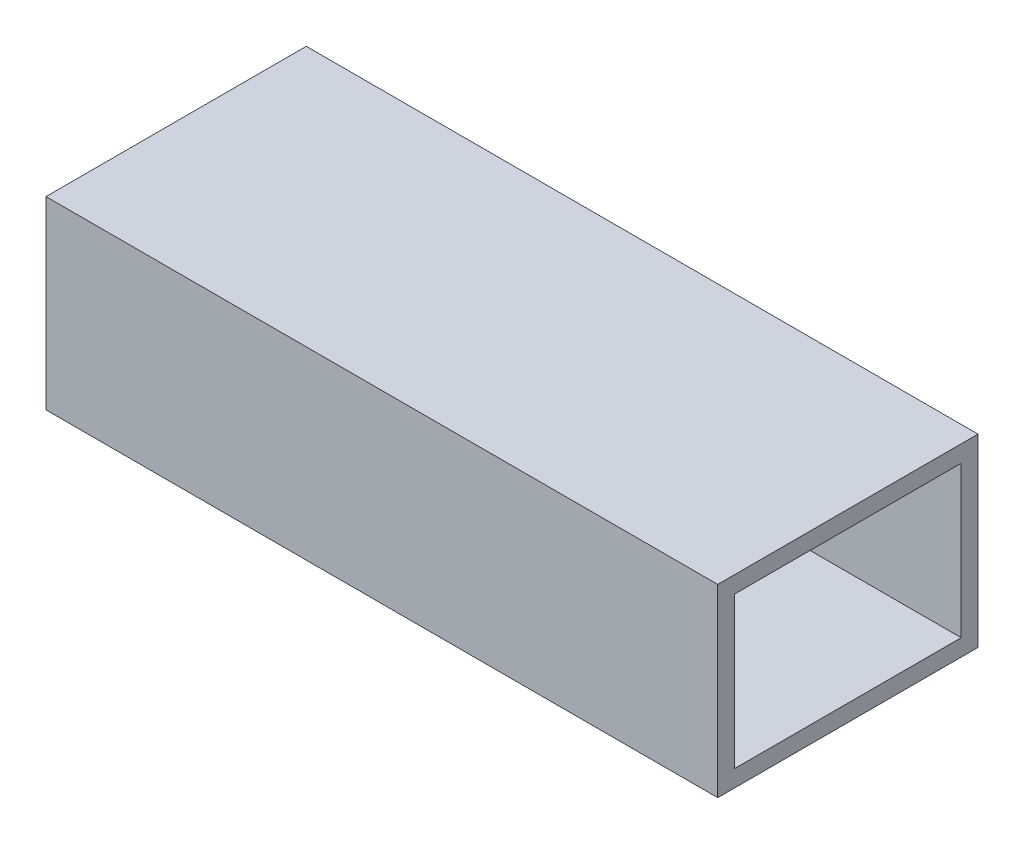
ISO-10303-21;
HEADER;
FILE_DESCRIPTION(('STEP AP214'),'2;1');
FILE_NAME('part.step','',(''),(''),'','','');
FILE_SCHEMA(('AUTOMOTIVE_DESIGN { 1 0 10303 214 1 1 1 1 }'));
ENDSEC;
DATA;
#1=APPLICATION_CONTEXT('core data for automotive mechanical design processes');
#2=APPLICATION_PROTOCOL_DEFINITION('international standard','automotive_design',2000,#1);
#3=PRODUCT_CONTEXT('',#1,'mechanical');
#4=PRODUCT('Part','Part','',(#3));
#5=PRODUCT_RELATED_PRODUCT_CATEGORY('part','',(#4));
#6=PRODUCT_DEFINITION_FORMATION('','',#4);
#7=PRODUCT_DEFINITION_CONTEXT('part definition',#1,'design');
#8=PRODUCT_DEFINITION('design','',#6,#7);
#9=PRODUCT_DEFINITION_SHAPE('','',#8);
#10=(LENGTH_UNIT() NAMED_UNIT(*) SI_UNIT(.MILLI.,.METRE.));
#11=(NAMED_UNIT(*) PLANE_ANGLE_UNIT() SI_UNIT($,.RADIAN.));
#12=(NAMED_UNIT(*) SI_UNIT($,.STERADIAN.) SOLID_ANGLE_UNIT());
#13=UNCERTAINTY_MEASURE_WITH_UNIT(LENGTH_MEASURE(1.E-05),#10,'distance_accuracy_value','');
#14=(GEOMETRIC_REPRESENTATION_CONTEXT(3) GLOBAL_UNCERTAINTY_ASSIGNED_CONTEXT((#13)) GLOBAL_UNIT_ASSIGNED_CONTEXT((#10,
#11,#12)) REPRESENTATION_CONTEXT('',''));
#15=CARTESIAN_POINT('',(0.,0.,0.));
#16=DIRECTION('',(0.,0.,1.));
#17=DIRECTION('',(1.,0.,0.));
#18=AXIS2_PLACEMENT_3D('',#15,#16,#17);
#19=CARTESIAN_POINT('',(203.2,0.,0.));
#20=DIRECTION('',(1.,0.,0.));
#21=DIRECTION('',(0.,0.,-1.));
#22=AXIS2_PLACEMENT_3D('',#19,#20,#21);
#23=PLANE('',#22);
#24=DIRECTION('',(0.,0.,-1.));
#25=VECTOR('',#24,1.);
#26=CARTESIAN_POINT('',(203.2,-5.08,5.08));
#27=LINE('',#26,#25);
#28=CARTESIAN_POINT('',(203.2,-5.08,5.08));
#29=VERTEX_POINT('',#28);
#30=CARTESIAN_POINT('',(203.2,-5.08,-73.66));
#31=VERTEX_POINT('',#30);
#32=EDGE_CURVE('E134',#29,#31,#27,.T.);
#33=ORIENTED_EDGE('',*,*,#32,.T.);
#34=DIRECTION('',(0.,1.,0.));
#35=VECTOR('',#34,1.);
#36=CARTESIAN_POINT('',(203.2,-5.08,-73.66));
#37=LINE('',#36,#35);
#38=CARTESIAN_POINT('',(203.2,50.8,-73.66));
#39=VERTEX_POINT('',#38);
#40=EDGE_CURVE('E137',#31,#39,#37,.T.);
#41=ORIENTED_EDGE('',*,*,#40,.T.);
#42=DIRECTION('',(0.,0.,1.));
#43=VECTOR('',#42,1.);
#44=CARTESIAN_POINT('',(203.2,50.8,5.08));
#45=LINE('',#44,#43);
#46=CARTESIAN_POINT('',(203.2,50.8,5.08));
#47=VERTEX_POINT('',#46);
#48=EDGE_CURVE('E140',#39,#47,#45,.T.);
#49=ORIENTED_EDGE('',*,*,#48,.T.);
#50=DIRECTION('',(0.,-1.,0.));
#51=VECTOR('',#50,1.);
#52=CARTESIAN_POINT('',(203.2,-5.08,5.08));
#53=LINE('',#52,#51);
#54=EDGE_CURVE('E142',#47,#29,#53,.T.);
#55=ORIENTED_EDGE('',*,*,#54,.T.);
#56=EDGE_LOOP('',(#33,#41,#49,#55));
#57=FACE_BOUND('',#56,.T.);
#58=DIRECTION('',(0.,0.,-1.));
#59=VECTOR('',#58,1.);
#60=CARTESIAN_POINT('',(203.2,0.,0.));
#61=LINE('',#60,#59);
#62=CARTESIAN_POINT('',(203.2,0.,0.));
#63=VERTEX_POINT('',#62);
#64=CARTESIAN_POINT('',(203.2,0.,-68.58));
#65=VERTEX_POINT('',#64);
#66=EDGE_CURVE('E106',#63,#65,#61,.T.);
#67=ORIENTED_EDGE('',*,*,#66,.F.);
#68=DIRECTION('',(0.,-1.,0.));
#69=VECTOR('',#68,1.);
#70=CARTESIAN_POINT('',(203.2,0.,0.));
#71=LINE('',#70,#69);
#72=CARTESIAN_POINT('',(203.2,45.72,0.));
#73=VERTEX_POINT('',#72);
#74=EDGE_CURVE('E98',#73,#63,#71,.T.);
#75=ORIENTED_EDGE('',*,*,#74,.F.);
#76=DIRECTION('',(0.,0.,1.));
#77=VECTOR('',#76,1.);
#78=CARTESIAN_POINT('',(203.2,45.72,0.));
#79=LINE('',#78,#77);
#80=CARTESIAN_POINT('',(203.2,45.72,-68.58));
#81=VERTEX_POINT('',#80);
#82=EDGE_CURVE('E120',#81,#73,#79,.T.);
#83=ORIENTED_EDGE('',*,*,#82,.F.);
#84=DIRECTION('',(0.,1.,0.));
#85=VECTOR('',#84,1.);
#86=CARTESIAN_POINT('',(203.2,0.,-68.58));
#87=LINE('',#86,#85);
#88=EDGE_CURVE('E118',#65,#81,#87,.T.);
#89=ORIENTED_EDGE('',*,*,#88,.F.);
#90=EDGE_LOOP('',(#67,#75,#83,#89));
#91=FACE_BOUND('',#90,.T.);
#92=ADVANCED_FACE('F33',(#57,#91),#23,.T.);
#93=CARTESIAN_POINT('',(0.,0.,0.));
#94=DIRECTION('',(1.,0.,0.));
#95=DIRECTION('',(0.,0.,-1.));
#96=AXIS2_PLACEMENT_3D('',#93,#94,#95);
#97=PLANE('',#96);
#98=DIRECTION('',(0.,0.,-1.));
#99=VECTOR('',#98,1.);
#100=CARTESIAN_POINT('',(0.,-5.08,5.08));
#101=LINE('',#100,#99);
#102=CARTESIAN_POINT('',(0.,-5.08,5.08));
#103=VERTEX_POINT('',#102);
#104=CARTESIAN_POINT('',(0.,-5.08,-73.66));
#105=VERTEX_POINT('',#104);
#106=EDGE_CURVE('E114',#103,#105,#101,.T.);
#107=ORIENTED_EDGE('',*,*,#106,.F.);
#108=DIRECTION('',(0.,-1.,0.));
#109=VECTOR('',#108,1.);
#110=CARTESIAN_POINT('',(0.,-5.08,5.08));
#111=LINE('',#110,#109);
#112=CARTESIAN_POINT('',(0.,50.8,5.08));
#113=VERTEX_POINT('',#112);
#114=EDGE_CURVE('E138',#113,#103,#111,.T.);
#115=ORIENTED_EDGE('',*,*,#114,.F.);
#116=DIRECTION('',(0.,0.,1.));
#117=VECTOR('',#116,1.);
#118=CARTESIAN_POINT('',(0.,50.8,5.08));
#119=LINE('',#118,#117);
#120=CARTESIAN_POINT('',(0.,50.8,-73.66));
#121=VERTEX_POINT('',#120);
#122=EDGE_CURVE('E149',#121,#113,#119,.T.);
#123=ORIENTED_EDGE('',*,*,#122,.F.);
#124=DIRECTION('',(0.,1.,0.));
#125=VECTOR('',#124,1.);
#126=CARTESIAN_POINT('',(0.,-5.08,-73.66));
#127=LINE('',#126,#125);
#128=EDGE_CURVE('E147',#105,#121,#127,.T.);
#129=ORIENTED_EDGE('',*,*,#128,.F.);
#130=EDGE_LOOP('',(#107,#115,#123,#129));
#131=FACE_BOUND('',#130,.T.);
#132=DIRECTION('',(0.,-1.,0.));
#133=VECTOR('',#132,1.);
#134=CARTESIAN_POINT('',(0.,0.,0.));
#135=LINE('',#134,#133);
#136=CARTESIAN_POINT('',(0.,45.72,0.));
#137=VERTEX_POINT('',#136);
#138=CARTESIAN_POINT('',(0.,0.,0.));
#139=VERTEX_POINT('',#138);
#140=EDGE_CURVE('E56',#137,#139,#135,.T.);
#141=ORIENTED_EDGE('',*,*,#140,.T.);
#142=DIRECTION('',(0.,0.,-1.));
#143=VECTOR('',#142,1.);
#144=CARTESIAN_POINT('',(0.,0.,0.));
#145=LINE('',#144,#143);
#146=CARTESIAN_POINT('',(0.,0.,-68.58));
#147=VERTEX_POINT('',#146);
#148=EDGE_CURVE('E113',#139,#147,#145,.T.);
#149=ORIENTED_EDGE('',*,*,#148,.T.);
#150=DIRECTION('',(0.,1.,0.));
#151=VECTOR('',#150,1.);
#152=CARTESIAN_POINT('',(0.,0.,-68.58));
#153=LINE('',#152,#151);
#154=CARTESIAN_POINT('',(0.,45.72,-68.58));
#155=VERTEX_POINT('',#154);
#156=EDGE_CURVE('E126',#147,#155,#153,.T.);
#157=ORIENTED_EDGE('',*,*,#156,.T.);
#158=DIRECTION('',(0.,0.,1.));
#159=VECTOR('',#158,1.);
#160=CARTESIAN_POINT('',(0.,45.72,0.));
#161=LINE('',#160,#159);
#162=EDGE_CURVE('E107',#155,#137,#161,.T.);
#163=ORIENTED_EDGE('',*,*,#162,.T.);
#164=EDGE_LOOP('',(#141,#149,#157,#163));
#165=FACE_BOUND('',#164,.T.);
#166=ADVANCED_FACE('F167',(#131,#165),#97,.F.);
#167=CARTESIAN_POINT('',(203.2,-5.08,5.08));
#168=DIRECTION('',(0.,1.,0.));
#169=DIRECTION('',(0.,0.,1.));
#170=AXIS2_PLACEMENT_3D('',#167,#168,#169);
#171=PLANE('',#170);
#172=ORIENTED_EDGE('',*,*,#106,.T.);
#173=DIRECTION('',(-1.,0.,0.));
#174=VECTOR('',#173,1.);
#175=CARTESIAN_POINT('',(203.2,-5.08,-73.66));
#176=LINE('',#175,#174);
#177=EDGE_CURVE('E11',#31,#105,#176,.T.);
#178=ORIENTED_EDGE('',*,*,#177,.F.);
#179=ORIENTED_EDGE('',*,*,#32,.F.);
#180=DIRECTION('',(-1.,0.,0.));
#181=VECTOR('',#180,1.);
#182=CARTESIAN_POINT('',(203.2,-5.08,5.08));
#183=LINE('',#182,#181);
#184=EDGE_CURVE('E144',#29,#103,#183,.T.);
#185=ORIENTED_EDGE('',*,*,#184,.T.);
#186=EDGE_LOOP('',(#172,#178,#179,#185));
#187=FACE_BOUND('',#186,.T.);
#188=ADVANCED_FACE('F35',(#187),#171,.F.);
#189=CARTESIAN_POINT('',(203.2,-5.08,-73.66));
#190=DIRECTION('',(0.,0.,1.));
#191=DIRECTION('',(1.,0.,0.));
#192=AXIS2_PLACEMENT_3D('',#189,#190,#191);
#193=PLANE('',#192);
#194=ORIENTED_EDGE('',*,*,#128,.T.);
#195=DIRECTION('',(-1.,0.,0.));
#196=VECTOR('',#195,1.);
#197=CARTESIAN_POINT('',(203.2,50.8,-73.66));
#198=LINE('',#197,#196);
#199=EDGE_CURVE('E41',#39,#121,#198,.T.);
#200=ORIENTED_EDGE('',*,*,#199,.F.);
#201=ORIENTED_EDGE('',*,*,#40,.F.);
#202=ORIENTED_EDGE('',*,*,#177,.T.);
#203=EDGE_LOOP('',(#194,#200,#201,#202));
#204=FACE_BOUND('',#203,.T.);
#205=ADVANCED_FACE('F177',(#204),#193,.F.);
#206=CARTESIAN_POINT('',(203.2,50.8,5.08));
#207=DIRECTION('',(0.,-1.,0.));
#208=DIRECTION('',(0.,0.,-1.));
#209=AXIS2_PLACEMENT_3D('',#206,#207,#208);
#210=PLANE('',#209);
#211=ORIENTED_EDGE('',*,*,#122,.T.);
#212=DIRECTION('',(-1.,0.,0.));
#213=VECTOR('',#212,1.);
#214=CARTESIAN_POINT('',(203.2,50.8,5.08));
#215=LINE('',#214,#213);
#216=EDGE_CURVE('E154',#47,#113,#215,.T.);
#217=ORIENTED_EDGE('',*,*,#216,.F.);
#218=ORIENTED_EDGE('',*,*,#48,.F.);
#219=ORIENTED_EDGE('',*,*,#199,.T.);
#220=EDGE_LOOP('',(#211,#217,#218,#219));
#221=FACE_BOUND('',#220,.T.);
#222=ADVANCED_FACE('F161',(#221),#210,.F.);
#223=CARTESIAN_POINT('',(203.2,-5.08,5.08));
#224=DIRECTION('',(0.,0.,-1.));
#225=DIRECTION('',(-1.,0.,0.));
#226=AXIS2_PLACEMENT_3D('',#223,#224,#225);
#227=PLANE('',#226);
#228=ORIENTED_EDGE('',*,*,#114,.T.);
#229=ORIENTED_EDGE('',*,*,#184,.F.);
#230=ORIENTED_EDGE('',*,*,#54,.F.);
#231=ORIENTED_EDGE('',*,*,#216,.T.);
#232=EDGE_LOOP('',(#228,#229,#230,#231));
#233=FACE_BOUND('',#232,.T.);
#234=ADVANCED_FACE('F171',(#233),#227,.F.);
#235=CARTESIAN_POINT('',(203.2,0.,0.));
#236=DIRECTION('',(0.,0.,-1.));
#237=DIRECTION('',(-1.,0.,0.));
#238=AXIS2_PLACEMENT_3D('',#235,#236,#237);
#239=PLANE('',#238);
#240=ORIENTED_EDGE('',*,*,#140,.F.);
#241=DIRECTION('',(-1.,0.,0.));
#242=VECTOR('',#241,1.);
#243=CARTESIAN_POINT('',(203.2,45.72,0.));
#244=LINE('',#243,#242);
#245=EDGE_CURVE('E102',#73,#137,#244,.T.);
#246=ORIENTED_EDGE('',*,*,#245,.F.);
#247=ORIENTED_EDGE('',*,*,#74,.T.);
#248=DIRECTION('',(-1.,0.,0.));
#249=VECTOR('',#248,1.);
#250=CARTESIAN_POINT('',(203.2,0.,0.));
#251=LINE('',#250,#249);
#252=EDGE_CURVE('E101',#63,#139,#251,.T.);
#253=ORIENTED_EDGE('',*,*,#252,.T.);
#254=EDGE_LOOP('',(#240,#246,#247,#253));
#255=FACE_BOUND('',#254,.T.);
#256=ADVANCED_FACE('F100',(#255),#239,.T.);
#257=CARTESIAN_POINT('',(203.2,0.,0.));
#258=DIRECTION('',(0.,1.,0.));
#259=DIRECTION('',(0.,0.,1.));
#260=AXIS2_PLACEMENT_3D('',#257,#258,#259);
#261=PLANE('',#260);
#262=ORIENTED_EDGE('',*,*,#148,.F.);
#263=ORIENTED_EDGE('',*,*,#252,.F.);
#264=ORIENTED_EDGE('',*,*,#66,.T.);
#265=DIRECTION('',(-1.,0.,0.));
#266=VECTOR('',#265,1.);
#267=CARTESIAN_POINT('',(203.2,0.,-68.58));
#268=LINE('',#267,#266);
#269=EDGE_CURVE('E115',#65,#147,#268,.T.);
#270=ORIENTED_EDGE('',*,*,#269,.T.);
#271=EDGE_LOOP('',(#262,#263,#264,#270));
#272=FACE_BOUND('',#271,.T.);
#273=ADVANCED_FACE('F110',(#272),#261,.T.);
#274=CARTESIAN_POINT('',(203.2,0.,-68.58));
#275=DIRECTION('',(0.,0.,1.));
#276=DIRECTION('',(1.,0.,0.));
#277=AXIS2_PLACEMENT_3D('',#274,#275,#276);
#278=PLANE('',#277);
#279=ORIENTED_EDGE('',*,*,#156,.F.);
#280=ORIENTED_EDGE('',*,*,#269,.F.);
#281=ORIENTED_EDGE('',*,*,#88,.T.);
#282=DIRECTION('',(-1.,0.,0.));
#283=VECTOR('',#282,1.);
#284=CARTESIAN_POINT('',(203.2,45.72,-68.58));
#285=LINE('',#284,#283);
#286=EDGE_CURVE('E48',#81,#155,#285,.T.);
#287=ORIENTED_EDGE('',*,*,#286,.T.);
#288=EDGE_LOOP('',(#279,#280,#281,#287));
#289=FACE_BOUND('',#288,.T.);
#290=ADVANCED_FACE('F200',(#289),#278,.T.);
#291=CARTESIAN_POINT('',(203.2,45.72,0.));
#292=DIRECTION('',(0.,-1.,0.));
#293=DIRECTION('',(0.,0.,-1.));
#294=AXIS2_PLACEMENT_3D('',#291,#292,#293);
#295=PLANE('',#294);
#296=ORIENTED_EDGE('',*,*,#162,.F.);
#297=ORIENTED_EDGE('',*,*,#286,.F.);
#298=ORIENTED_EDGE('',*,*,#82,.T.);
#299=ORIENTED_EDGE('',*,*,#245,.T.);
#300=EDGE_LOOP('',(#296,#297,#298,#299));
#301=FACE_BOUND('',#300,.T.);
#302=ADVANCED_FACE('F204',(#301),#295,.T.);
#303=CLOSED_SHELL('',(#92,#166,#188,#205,#222,#234,#256,#273,#290,#302));
#304=MANIFOLD_SOLID_BREP('B2',#303);
#305=ADVANCED_BREP_SHAPE_REPRESENTATION('',(#18,#304),#14);
#306=SHAPE_DEFINITION_REPRESENTATION(#9,#305);
ENDSEC;
END-ISO-10303-21;
